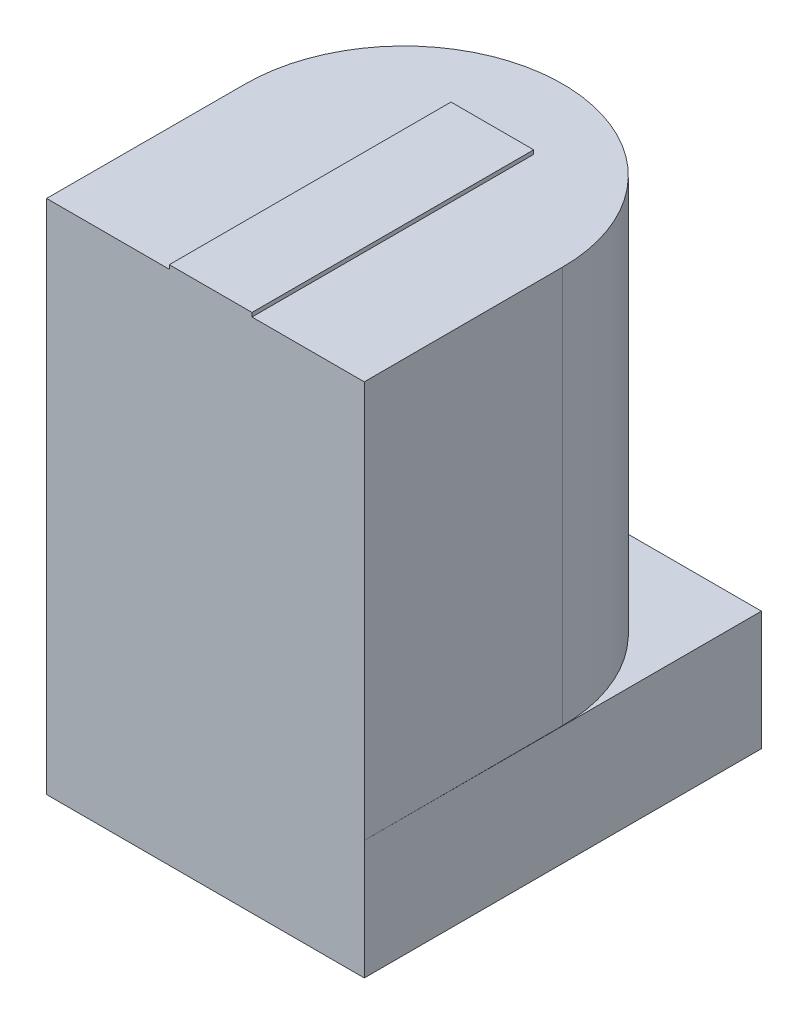
ISO-10303-21;
HEADER;
FILE_DESCRIPTION(('STEP AP214'),'2;1');
FILE_NAME('part.step','',(''),(''),'','','');
FILE_SCHEMA(('AUTOMOTIVE_DESIGN { 1 0 10303 214 1 1 1 1 }'));
ENDSEC;
DATA;
#1=APPLICATION_CONTEXT('core data for automotive mechanical design processes');
#2=APPLICATION_PROTOCOL_DEFINITION('international standard','automotive_design',2000,#1);
#3=PRODUCT_CONTEXT('',#1,'mechanical');
#4=PRODUCT('Part','Part','',(#3));
#5=PRODUCT_RELATED_PRODUCT_CATEGORY('part','',(#4));
#6=PRODUCT_DEFINITION_FORMATION('','',#4);
#7=PRODUCT_DEFINITION_CONTEXT('part definition',#1,'design');
#8=PRODUCT_DEFINITION('design','',#6,#7);
#9=PRODUCT_DEFINITION_SHAPE('','',#8);
#10=(LENGTH_UNIT() NAMED_UNIT(*) SI_UNIT(.MILLI.,.METRE.));
#11=(NAMED_UNIT(*) PLANE_ANGLE_UNIT() SI_UNIT($,.RADIAN.));
#12=(NAMED_UNIT(*) SI_UNIT($,.STERADIAN.) SOLID_ANGLE_UNIT());
#13=UNCERTAINTY_MEASURE_WITH_UNIT(LENGTH_MEASURE(1.E-05),#10,'distance_accuracy_value','');
#14=(GEOMETRIC_REPRESENTATION_CONTEXT(3) GLOBAL_UNCERTAINTY_ASSIGNED_CONTEXT((#13)) GLOBAL_UNIT_ASSIGNED_CONTEXT((#10,
#11,#12)) REPRESENTATION_CONTEXT('',''));
#15=CARTESIAN_POINT('',(0.,0.,0.));
#16=DIRECTION('',(0.,0.,1.));
#17=DIRECTION('',(1.,0.,0.));
#18=AXIS2_PLACEMENT_3D('',#15,#16,#17);
#19=CARTESIAN_POINT('',(0.,3.,0.));
#20=DIRECTION('',(0.,-1.,0.));
#21=DIRECTION('',(0.,0.,-1.));
#22=AXIS2_PLACEMENT_3D('',#19,#20,#21);
#23=PLANE('',#22);
#24=DIRECTION('',(-0.00119329384643438,0.,-0.999999288024645));
#25=VECTOR('',#24,1.);
#26=CARTESIAN_POINT('',(8.,3.,0.));
#27=LINE('',#26,#25);
#28=CARTESIAN_POINT('',(8.,3.,0.));
#29=VERTEX_POINT('',#28);
#30=CARTESIAN_POINT('',(7.99403352651985,3.,-5.));
#31=VERTEX_POINT('',#30);
#32=EDGE_CURVE('E175',#29,#31,#27,.T.);
#33=ORIENTED_EDGE('',*,*,#32,.F.);
#34=DIRECTION('',(0.,0.,-1.));
#35=VECTOR('',#34,1.);
#36=CARTESIAN_POINT('',(8.,3.,0.));
#37=LINE('',#36,#35);
#38=CARTESIAN_POINT('',(8.,3.,-10.));
#39=VERTEX_POINT('',#38);
#40=EDGE_CURVE('E194',#29,#39,#37,.T.);
#41=ORIENTED_EDGE('',*,*,#40,.T.);
#42=DIRECTION('',(-1.,0.,0.));
#43=VECTOR('',#42,1.);
#44=CARTESIAN_POINT('',(0.,3.,-10.));
#45=LINE('',#44,#43);
#46=CARTESIAN_POINT('',(0.,3.,-10.));
#47=VERTEX_POINT('',#46);
#48=EDGE_CURVE('E197',#39,#47,#45,.T.);
#49=ORIENTED_EDGE('',*,*,#48,.T.);
#50=DIRECTION('',(0.,0.,1.));
#51=VECTOR('',#50,1.);
#52=CARTESIAN_POINT('',(0.,3.,0.));
#53=LINE('',#52,#51);
#54=CARTESIAN_POINT('',(0.,3.,0.));
#55=VERTEX_POINT('',#54);
#56=EDGE_CURVE('E191',#47,#55,#53,.T.);
#57=ORIENTED_EDGE('',*,*,#56,.T.);
#58=DIRECTION('',(-0.00119329384643473,0.,0.999999288024645));
#59=VECTOR('',#58,1.);
#60=CARTESIAN_POINT('',(0.00596647348015573,3.,-5.));
#61=LINE('',#60,#59);
#62=CARTESIAN_POINT('',(0.00596647348015573,3.,-5.));
#63=VERTEX_POINT('',#62);
#64=EDGE_CURVE('E172',#63,#55,#61,.T.);
#65=ORIENTED_EDGE('',*,*,#64,.F.);
#66=CARTESIAN_POINT('',(4.,3.,-5.));
#67=DIRECTION('',(0.,1.,0.));
#68=DIRECTION('',(0.,0.,1.));
#69=AXIS2_PLACEMENT_3D('',#66,#67,#68);
#70=CIRCLE('',#69,3.99403352651985);
#71=EDGE_CURVE('E169',#31,#63,#70,.T.);
#72=ORIENTED_EDGE('',*,*,#71,.F.);
#73=EDGE_LOOP('',(#33,#41,#49,#57,#65,#72));
#74=FACE_BOUND('',#73,.T.);
#75=ADVANCED_FACE('F35',(#74),#23,.F.);
#76=CARTESIAN_POINT('',(0.,3.,0.));
#77=DIRECTION('',(1.,0.,0.));
#78=DIRECTION('',(0.,0.,-1.));
#79=AXIS2_PLACEMENT_3D('',#76,#77,#78);
#80=PLANE('',#79);
#81=DIRECTION('',(0.,0.,1.));
#82=VECTOR('',#81,1.);
#83=CARTESIAN_POINT('',(0.,0.,0.));
#84=LINE('',#83,#82);
#85=CARTESIAN_POINT('',(0.,0.,-10.));
#86=VERTEX_POINT('',#85);
#87=CARTESIAN_POINT('',(0.,0.,0.));
#88=VERTEX_POINT('',#87);
#89=EDGE_CURVE('E190',#86,#88,#84,.T.);
#90=ORIENTED_EDGE('',*,*,#89,.T.);
#91=DIRECTION('',(0.,-1.,0.));
#92=VECTOR('',#91,1.);
#93=CARTESIAN_POINT('',(0.,3.,0.));
#94=LINE('',#93,#92);
#95=EDGE_CURVE('E11',#55,#88,#94,.T.);
#96=ORIENTED_EDGE('',*,*,#95,.F.);
#97=ORIENTED_EDGE('',*,*,#56,.F.);
#98=DIRECTION('',(0.,-1.,0.));
#99=VECTOR('',#98,1.);
#100=CARTESIAN_POINT('',(0.,3.,-10.));
#101=LINE('',#100,#99);
#102=EDGE_CURVE('E199',#47,#86,#101,.T.);
#103=ORIENTED_EDGE('',*,*,#102,.T.);
#104=EDGE_LOOP('',(#90,#96,#97,#103));
#105=FACE_BOUND('',#104,.T.);
#106=ADVANCED_FACE('F37',(#105),#80,.F.);
#107=CARTESIAN_POINT('',(0.,3.,0.));
#108=DIRECTION('',(0.,0.,-1.));
#109=DIRECTION('',(-1.,0.,0.));
#110=AXIS2_PLACEMENT_3D('',#107,#108,#109);
#111=PLANE('',#110);
#112=DIRECTION('',(1.,0.,0.));
#113=VECTOR('',#112,1.);
#114=CARTESIAN_POINT('',(0.,0.,0.));
#115=LINE('',#114,#113);
#116=CARTESIAN_POINT('',(8.,0.,0.));
#117=VERTEX_POINT('',#116);
#118=EDGE_CURVE('E202',#88,#117,#115,.T.);
#119=ORIENTED_EDGE('',*,*,#118,.T.);
#120=DIRECTION('',(0.,-1.,0.));
#121=VECTOR('',#120,1.);
#122=CARTESIAN_POINT('',(8.,3.,0.));
#123=LINE('',#122,#121);
#124=EDGE_CURVE('E45',#29,#117,#123,.T.);
#125=ORIENTED_EDGE('',*,*,#124,.F.);
#126=DIRECTION('',(0.,-1.,0.));
#127=VECTOR('',#126,1.);
#128=CARTESIAN_POINT('',(8.,13.,0.));
#129=LINE('',#128,#127);
#130=CARTESIAN_POINT('',(8.,13.,0.));
#131=VERTEX_POINT('',#130);
#132=EDGE_CURVE('E181',#131,#29,#129,.T.);
#133=ORIENTED_EDGE('',*,*,#132,.F.);
#134=DIRECTION('',(1.,0.,0.));
#135=VECTOR('',#134,1.);
#136=CARTESIAN_POINT('',(0.,13.,0.));
#137=LINE('',#136,#135);
#138=CARTESIAN_POINT('',(5.17285677699763,13.,0.));
#139=VERTEX_POINT('',#138);
#140=EDGE_CURVE('E156',#139,#131,#137,.T.);
#141=ORIENTED_EDGE('',*,*,#140,.F.);
#142=DIRECTION('',(0.,-1.,0.));
#143=VECTOR('',#142,1.);
#144=CARTESIAN_POINT('',(5.17285677699763,13.1,0.));
#145=LINE('',#144,#143);
#146=CARTESIAN_POINT('',(5.17285677699763,13.1,0.));
#147=VERTEX_POINT('',#146);
#148=EDGE_CURVE('E126',#147,#139,#145,.T.);
#149=ORIENTED_EDGE('',*,*,#148,.F.);
#150=DIRECTION('',(1.,0.,0.));
#151=VECTOR('',#150,1.);
#152=CARTESIAN_POINT('',(3.09002491439839,13.1,0.));
#153=LINE('',#152,#151);
#154=CARTESIAN_POINT('',(3.09002491439839,13.1,0.));
#155=VERTEX_POINT('',#154);
#156=EDGE_CURVE('E119',#155,#147,#153,.T.);
#157=ORIENTED_EDGE('',*,*,#156,.F.);
#158=DIRECTION('',(0.,-1.,0.));
#159=VECTOR('',#158,1.);
#160=CARTESIAN_POINT('',(3.09002491439839,13.1,0.));
#161=LINE('',#160,#159);
#162=CARTESIAN_POINT('',(3.09002491439839,13.,0.));
#163=VERTEX_POINT('',#162);
#164=EDGE_CURVE('E124',#155,#163,#161,.T.);
#165=ORIENTED_EDGE('',*,*,#164,.T.);
#166=CARTESIAN_POINT('',(0.,13.,0.));
#167=VERTEX_POINT('',#166);
#168=EDGE_CURVE('E159',#167,#163,#137,.T.);
#169=ORIENTED_EDGE('',*,*,#168,.F.);
#170=DIRECTION('',(0.,-1.,0.));
#171=VECTOR('',#170,1.);
#172=CARTESIAN_POINT('',(0.,13.,0.));
#173=LINE('',#172,#171);
#174=EDGE_CURVE('E184',#167,#55,#173,.T.);
#175=ORIENTED_EDGE('',*,*,#174,.T.);
#176=ORIENTED_EDGE('',*,*,#95,.T.);
#177=EDGE_LOOP('',(#119,#125,#133,#141,#149,#157,#165,#169,#175,#176));
#178=FACE_BOUND('',#177,.T.);
#179=ADVANCED_FACE('F121',(#178),#111,.F.);
#180=CARTESIAN_POINT('',(8.,3.,0.));
#181=DIRECTION('',(-1.,0.,0.));
#182=DIRECTION('',(0.,0.,1.));
#183=AXIS2_PLACEMENT_3D('',#180,#181,#182);
#184=PLANE('',#183);
#185=DIRECTION('',(0.,0.,-1.));
#186=VECTOR('',#185,1.);
#187=CARTESIAN_POINT('',(8.,0.,0.));
#188=LINE('',#187,#186);
#189=CARTESIAN_POINT('',(8.,0.,-10.));
#190=VERTEX_POINT('',#189);
#191=EDGE_CURVE('E204',#117,#190,#188,.T.);
#192=ORIENTED_EDGE('',*,*,#191,.T.);
#193=DIRECTION('',(0.,-1.,0.));
#194=VECTOR('',#193,1.);
#195=CARTESIAN_POINT('',(8.,3.,-10.));
#196=LINE('',#195,#194);
#197=EDGE_CURVE('E209',#39,#190,#196,.T.);
#198=ORIENTED_EDGE('',*,*,#197,.F.);
#199=ORIENTED_EDGE('',*,*,#40,.F.);
#200=ORIENTED_EDGE('',*,*,#124,.T.);
#201=EDGE_LOOP('',(#192,#198,#199,#200));
#202=FACE_BOUND('',#201,.T.);
#203=ADVANCED_FACE('F217',(#202),#184,.F.);
#204=CARTESIAN_POINT('',(0.,3.,-10.));
#205=DIRECTION('',(0.,0.,1.));
#206=DIRECTION('',(1.,0.,0.));
#207=AXIS2_PLACEMENT_3D('',#204,#205,#206);
#208=PLANE('',#207);
#209=DIRECTION('',(-1.,0.,0.));
#210=VECTOR('',#209,1.);
#211=CARTESIAN_POINT('',(0.,0.,-10.));
#212=LINE('',#211,#210);
#213=EDGE_CURVE('E195',#190,#86,#212,.T.);
#214=ORIENTED_EDGE('',*,*,#213,.T.);
#215=ORIENTED_EDGE('',*,*,#102,.F.);
#216=ORIENTED_EDGE('',*,*,#48,.F.);
#217=ORIENTED_EDGE('',*,*,#197,.T.);
#218=EDGE_LOOP('',(#214,#215,#216,#217));
#219=FACE_BOUND('',#218,.T.);
#220=ADVANCED_FACE('F226',(#219),#208,.F.);
#221=CARTESIAN_POINT('',(0.,0.,0.));
#222=DIRECTION('',(0.,-1.,0.));
#223=DIRECTION('',(0.,0.,-1.));
#224=AXIS2_PLACEMENT_3D('',#221,#222,#223);
#225=PLANE('',#224);
#226=CARTESIAN_POINT('',(4.,0.,-5.51233761441949));
#227=DIRECTION('',(0.,-1.,0.));
#228=DIRECTION('',(0.,0.,-1.));
#229=AXIS2_PLACEMENT_3D('',#226,#227,#228);
#230=CIRCLE('',#229,2.5);
#231=CARTESIAN_POINT('',(4.,0.,-8.01233761441949));
#232=VERTEX_POINT('',#231);
#233=EDGE_CURVE('E142',#232,#232,#230,.T.);
#234=ORIENTED_EDGE('',*,*,#233,.F.);
#235=EDGE_LOOP('',(#234));
#236=FACE_BOUND('',#235,.T.);
#237=ORIENTED_EDGE('',*,*,#89,.F.);
#238=ORIENTED_EDGE('',*,*,#213,.F.);
#239=ORIENTED_EDGE('',*,*,#191,.F.);
#240=ORIENTED_EDGE('',*,*,#118,.F.);
#241=EDGE_LOOP('',(#237,#238,#239,#240));
#242=FACE_BOUND('',#241,.T.);
#243=ADVANCED_FACE('F223',(#236,#242),#225,.T.);
#244=CARTESIAN_POINT('',(4.,13.,-5.));
#245=DIRECTION('',(0.,-1.,0.));
#246=DIRECTION('',(0.,0.,-1.));
#247=AXIS2_PLACEMENT_3D('',#244,#245,#246);
#248=CYLINDRICAL_SURFACE('',#247,3.99403352651985);
#249=ORIENTED_EDGE('',*,*,#71,.T.);
#250=DIRECTION('',(0.,-1.,0.));
#251=VECTOR('',#250,1.);
#252=CARTESIAN_POINT('',(0.00596647348015573,13.,-5.));
#253=LINE('',#252,#251);
#254=CARTESIAN_POINT('',(0.00596647348015573,13.,-5.));
#255=VERTEX_POINT('',#254);
#256=EDGE_CURVE('E187',#255,#63,#253,.T.);
#257=ORIENTED_EDGE('',*,*,#256,.F.);
#258=CARTESIAN_POINT('',(4.,13.,-5.));
#259=DIRECTION('',(0.,1.,0.));
#260=DIRECTION('',(0.,0.,1.));
#261=AXIS2_PLACEMENT_3D('',#258,#259,#260);
#262=CIRCLE('',#261,3.99403352651985);
#263=CARTESIAN_POINT('',(7.99403352651985,13.,-5.));
#264=VERTEX_POINT('',#263);
#265=EDGE_CURVE('E178',#264,#255,#262,.T.);
#266=ORIENTED_EDGE('',*,*,#265,.F.);
#267=DIRECTION('',(0.,-1.,0.));
#268=VECTOR('',#267,1.);
#269=CARTESIAN_POINT('',(7.99403352651985,13.,-5.));
#270=LINE('',#269,#268);
#271=EDGE_CURVE('E168',#264,#31,#270,.T.);
#272=ORIENTED_EDGE('',*,*,#271,.T.);
#273=EDGE_LOOP('',(#249,#257,#266,#272));
#274=FACE_BOUND('',#273,.T.);
#275=ADVANCED_FACE('F268',(#274),#248,.T.);
#276=CARTESIAN_POINT('',(0.00596647348015573,13.,-5.));
#277=DIRECTION('',(0.999999288024645,0.,0.00119329384643473));
#278=DIRECTION('',(0.00119329384643473,0.,-0.999999288024645));
#279=AXIS2_PLACEMENT_3D('',#276,#277,#278);
#280=PLANE('',#279);
#281=ORIENTED_EDGE('',*,*,#64,.T.);
#282=ORIENTED_EDGE('',*,*,#174,.F.);
#283=DIRECTION('',(-0.00119329384643473,0.,0.999999288024645));
#284=VECTOR('',#283,1.);
#285=CARTESIAN_POINT('',(0.00596647348015573,13.,-5.));
#286=LINE('',#285,#284);
#287=EDGE_CURVE('E160',#255,#167,#286,.T.);
#288=ORIENTED_EDGE('',*,*,#287,.F.);
#289=ORIENTED_EDGE('',*,*,#256,.T.);
#290=EDGE_LOOP('',(#281,#282,#288,#289));
#291=FACE_BOUND('',#290,.T.);
#292=ADVANCED_FACE('F233',(#291),#280,.F.);
#293=CARTESIAN_POINT('',(8.,13.,0.));
#294=DIRECTION('',(-0.999999288024645,0.,0.00119329384643438));
#295=DIRECTION('',(0.00119329384643438,0.,0.999999288024645));
#296=AXIS2_PLACEMENT_3D('',#293,#294,#295);
#297=PLANE('',#296);
#298=ORIENTED_EDGE('',*,*,#32,.T.);
#299=ORIENTED_EDGE('',*,*,#271,.F.);
#300=DIRECTION('',(-0.00119329384643438,0.,-0.999999288024645));
#301=VECTOR('',#300,1.);
#302=CARTESIAN_POINT('',(8.,13.,0.));
#303=LINE('',#302,#301);
#304=EDGE_CURVE('E165',#131,#264,#303,.T.);
#305=ORIENTED_EDGE('',*,*,#304,.F.);
#306=ORIENTED_EDGE('',*,*,#132,.T.);
#307=EDGE_LOOP('',(#298,#299,#305,#306));
#308=FACE_BOUND('',#307,.T.);
#309=ADVANCED_FACE('F309',(#308),#297,.F.);
#310=CARTESIAN_POINT('',(4.,13.,-5.));
#311=DIRECTION('',(0.,1.,0.));
#312=DIRECTION('',(0.,0.,1.));
#313=AXIS2_PLACEMENT_3D('',#310,#311,#312);
#314=PLANE('',#313);
#315=DIRECTION('',(0.,0.,1.));
#316=VECTOR('',#315,1.);
#317=CARTESIAN_POINT('',(3.09002491439839,13.,-7.09294269688375));
#318=LINE('',#317,#316);
#319=CARTESIAN_POINT('',(3.09002491439839,13.,-7.09294269688375));
#320=VERTEX_POINT('',#319);
#321=EDGE_CURVE('E39',#320,#163,#318,.T.);
#322=ORIENTED_EDGE('',*,*,#321,.F.);
#323=DIRECTION('',(-1.,0.,0.));
#324=VECTOR('',#323,1.);
#325=CARTESIAN_POINT('',(3.09002491439839,13.,-7.09294269688375));
#326=LINE('',#325,#324);
#327=CARTESIAN_POINT('',(5.17285677699763,13.,-7.09294269688375));
#328=VERTEX_POINT('',#327);
#329=EDGE_CURVE('E139',#328,#320,#326,.T.);
#330=ORIENTED_EDGE('',*,*,#329,.F.);
#331=DIRECTION('',(0.,0.,-1.));
#332=VECTOR('',#331,1.);
#333=CARTESIAN_POINT('',(5.17285677699763,13.,-7.09294269688375));
#334=LINE('',#333,#332);
#335=EDGE_CURVE('E58',#139,#328,#334,.T.);
#336=ORIENTED_EDGE('',*,*,#335,.F.);
#337=ORIENTED_EDGE('',*,*,#140,.T.);
#338=ORIENTED_EDGE('',*,*,#304,.T.);
#339=ORIENTED_EDGE('',*,*,#265,.T.);
#340=ORIENTED_EDGE('',*,*,#287,.T.);
#341=ORIENTED_EDGE('',*,*,#168,.T.);
#342=EDGE_LOOP('',(#322,#330,#336,#337,#338,#339,#340,#341));
#343=FACE_BOUND('',#342,.T.);
#344=ADVANCED_FACE('F235',(#343),#314,.T.);
#345=CARTESIAN_POINT('',(4.,10.,-5.51233761441949));
#346=DIRECTION('',(0.,-1.,0.));
#347=DIRECTION('',(0.,0.,-1.));
#348=AXIS2_PLACEMENT_3D('',#345,#346,#347);
#349=CYLINDRICAL_SURFACE('',#348,2.5);
#350=CARTESIAN_POINT('',(4.,10.,-5.51233761441949));
#351=DIRECTION('',(0.,-1.,0.));
#352=DIRECTION('',(0.,0.,-1.));
#353=AXIS2_PLACEMENT_3D('',#350,#351,#352);
#354=CIRCLE('',#353,2.5);
#355=CARTESIAN_POINT('',(4.,10.,-8.01233761441949));
#356=VERTEX_POINT('',#355);
#357=EDGE_CURVE('E145',#356,#356,#354,.T.);
#358=ORIENTED_EDGE('',*,*,#357,.F.);
#359=EDGE_LOOP('',(#358));
#360=FACE_BOUND('',#359,.T.);
#361=ORIENTED_EDGE('',*,*,#233,.T.);
#362=EDGE_LOOP('',(#361));
#363=FACE_BOUND('',#362,.T.);
#364=ADVANCED_FACE('F320',(#360,#363),#349,.F.);
#365=CARTESIAN_POINT('',(4.,10.,-5.51233761441949));
#366=DIRECTION('',(0.,-1.,0.));
#367=DIRECTION('',(0.,0.,-1.));
#368=AXIS2_PLACEMENT_3D('',#365,#366,#367);
#369=PLANE('',#368);
#370=ORIENTED_EDGE('',*,*,#357,.T.);
#371=EDGE_LOOP('',(#370));
#372=FACE_BOUND('',#371,.T.);
#373=ADVANCED_FACE('F327',(#372),#369,.T.);
#374=CARTESIAN_POINT('',(3.09002491439839,13.1,-7.09294269688375));
#375=DIRECTION('',(1.,0.,0.));
#376=DIRECTION('',(0.,0.,-1.));
#377=AXIS2_PLACEMENT_3D('',#374,#375,#376);
#378=PLANE('',#377);
#379=ORIENTED_EDGE('',*,*,#321,.T.);
#380=ORIENTED_EDGE('',*,*,#164,.F.);
#381=DIRECTION('',(0.,0.,1.));
#382=VECTOR('',#381,1.);
#383=CARTESIAN_POINT('',(3.09002491439839,13.1,-7.09294269688375));
#384=LINE('',#383,#382);
#385=CARTESIAN_POINT('',(3.09002491439839,13.1,-7.09294269688375));
#386=VERTEX_POINT('',#385);
#387=EDGE_CURVE('E130',#386,#155,#384,.T.);
#388=ORIENTED_EDGE('',*,*,#387,.F.);
#389=DIRECTION('',(0.,-1.,0.));
#390=VECTOR('',#389,1.);
#391=CARTESIAN_POINT('',(3.09002491439839,13.1,-7.09294269688375));
#392=LINE('',#391,#390);
#393=EDGE_CURVE('E243',#386,#320,#392,.T.);
#394=ORIENTED_EDGE('',*,*,#393,.T.);
#395=EDGE_LOOP('',(#379,#380,#388,#394));
#396=FACE_BOUND('',#395,.T.);
#397=ADVANCED_FACE('F141',(#396),#378,.F.);
#398=CARTESIAN_POINT('',(5.17285677699763,13.1,-7.09294269688375));
#399=DIRECTION('',(-1.,0.,0.));
#400=DIRECTION('',(0.,0.,1.));
#401=AXIS2_PLACEMENT_3D('',#398,#399,#400);
#402=PLANE('',#401);
#403=ORIENTED_EDGE('',*,*,#335,.T.);
#404=DIRECTION('',(0.,-1.,0.));
#405=VECTOR('',#404,1.);
#406=CARTESIAN_POINT('',(5.17285677699763,13.1,-7.09294269688375));
#407=LINE('',#406,#405);
#408=CARTESIAN_POINT('',(5.17285677699763,13.1,-7.09294269688375));
#409=VERTEX_POINT('',#408);
#410=EDGE_CURVE('E147',#409,#328,#407,.T.);
#411=ORIENTED_EDGE('',*,*,#410,.F.);
#412=DIRECTION('',(0.,0.,-1.));
#413=VECTOR('',#412,1.);
#414=CARTESIAN_POINT('',(5.17285677699763,13.1,-7.09294269688375));
#415=LINE('',#414,#413);
#416=EDGE_CURVE('E129',#147,#409,#415,.T.);
#417=ORIENTED_EDGE('',*,*,#416,.F.);
#418=ORIENTED_EDGE('',*,*,#148,.T.);
#419=EDGE_LOOP('',(#403,#411,#417,#418));
#420=FACE_BOUND('',#419,.T.);
#421=ADVANCED_FACE('F250',(#420),#402,.F.);
#422=CARTESIAN_POINT('',(3.09002491439839,13.1,-7.09294269688375));
#423=DIRECTION('',(0.,0.,1.));
#424=DIRECTION('',(1.,0.,0.));
#425=AXIS2_PLACEMENT_3D('',#422,#423,#424);
#426=PLANE('',#425);
#427=ORIENTED_EDGE('',*,*,#329,.T.);
#428=ORIENTED_EDGE('',*,*,#393,.F.);
#429=DIRECTION('',(-1.,0.,0.));
#430=VECTOR('',#429,1.);
#431=CARTESIAN_POINT('',(3.09002491439839,13.1,-7.09294269688375));
#432=LINE('',#431,#430);
#433=EDGE_CURVE('E135',#409,#386,#432,.T.);
#434=ORIENTED_EDGE('',*,*,#433,.F.);
#435=ORIENTED_EDGE('',*,*,#410,.T.);
#436=EDGE_LOOP('',(#427,#428,#434,#435));
#437=FACE_BOUND('',#436,.T.);
#438=ADVANCED_FACE('F252',(#437),#426,.F.);
#439=CARTESIAN_POINT('',(0.,13.1,0.));
#440=DIRECTION('',(0.,1.,0.));
#441=DIRECTION('',(0.,0.,1.));
#442=AXIS2_PLACEMENT_3D('',#439,#440,#441);
#443=PLANE('',#442);
#444=ORIENTED_EDGE('',*,*,#387,.T.);
#445=ORIENTED_EDGE('',*,*,#156,.T.);
#446=ORIENTED_EDGE('',*,*,#416,.T.);
#447=ORIENTED_EDGE('',*,*,#433,.T.);
#448=EDGE_LOOP('',(#444,#445,#446,#447));
#449=FACE_BOUND('',#448,.T.);
#450=ADVANCED_FACE('F133',(#449),#443,.T.);
#451=CLOSED_SHELL('',(#75,#106,#179,#203,#220,#243,#275,#292,#309,#344,#364,#373,#397,#421,#438,#450));
#452=MANIFOLD_SOLID_BREP('B2',#451);
#453=ADVANCED_BREP_SHAPE_REPRESENTATION('',(#18,#452),#14);
#454=SHAPE_DEFINITION_REPRESENTATION(#9,#453);
ENDSEC;
END-ISO-10303-21;
